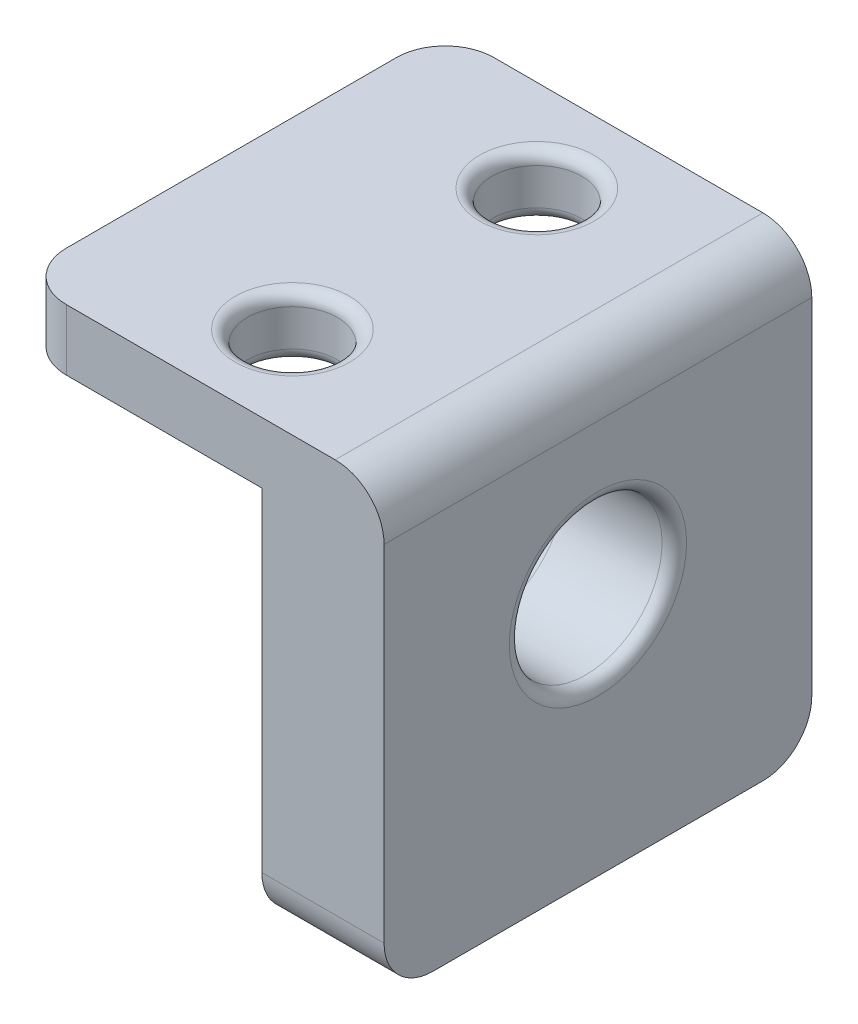
ISO-10303-21;
HEADER;
FILE_DESCRIPTION(('STEP AP214'),'2;1');
FILE_NAME('part.step','',(''),(''),'','','');
FILE_SCHEMA(('AUTOMOTIVE_DESIGN { 1 0 10303 214 1 1 1 1 }'));
ENDSEC;
DATA;
#1=APPLICATION_CONTEXT('core data for automotive mechanical design processes');
#2=APPLICATION_PROTOCOL_DEFINITION('international standard','automotive_design',2000,#1);
#3=PRODUCT_CONTEXT('',#1,'mechanical');
#4=PRODUCT('Part','Part','',(#3));
#5=PRODUCT_RELATED_PRODUCT_CATEGORY('part','',(#4));
#6=PRODUCT_DEFINITION_FORMATION('','',#4);
#7=PRODUCT_DEFINITION_CONTEXT('part definition',#1,'design');
#8=PRODUCT_DEFINITION('design','',#6,#7);
#9=PRODUCT_DEFINITION_SHAPE('','',#8);
#10=(LENGTH_UNIT() NAMED_UNIT(*) SI_UNIT(.MILLI.,.METRE.));
#11=(NAMED_UNIT(*) PLANE_ANGLE_UNIT() SI_UNIT($,.RADIAN.));
#12=(NAMED_UNIT(*) SI_UNIT($,.STERADIAN.) SOLID_ANGLE_UNIT());
#13=UNCERTAINTY_MEASURE_WITH_UNIT(LENGTH_MEASURE(1.E-05),#10,'distance_accuracy_value','');
#14=(GEOMETRIC_REPRESENTATION_CONTEXT(3) GLOBAL_UNCERTAINTY_ASSIGNED_CONTEXT((#13)) GLOBAL_UNIT_ASSIGNED_CONTEXT((#10,
#11,#12)) REPRESENTATION_CONTEXT('',''));
#15=CARTESIAN_POINT('',(0.,0.,0.));
#16=DIRECTION('',(0.,0.,1.));
#17=DIRECTION('',(1.,0.,0.));
#18=AXIS2_PLACEMENT_3D('',#15,#16,#17);
#19=CARTESIAN_POINT('',(19.05,-2.38125,11.1125));
#20=DIRECTION('',(0.,-1.,0.));
#21=DIRECTION('',(1.,0.,0.));
#22=AXIS2_PLACEMENT_3D('',#19,#20,#21);
#23=PLANE('',#22);
#24=CARTESIAN_POINT('',(9.525,-2.38125,-6.35));
#25=DIRECTION('',(0.,-1.,0.));
#26=DIRECTION('',(1.,0.,0.));
#27=AXIS2_PLACEMENT_3D('',#24,#25,#26);
#28=CIRCLE('',#27,2.9718);
#29=CARTESIAN_POINT('',(12.4968,-2.38125,-6.35));
#30=VERTEX_POINT('',#29);
#31=EDGE_CURVE('E240',#30,#30,#28,.T.);
#32=ORIENTED_EDGE('',*,*,#31,.T.);
#33=EDGE_LOOP('',(#32));
#34=FACE_BOUND('',#33,.T.);
#35=CARTESIAN_POINT('',(9.52500000000001,-2.38125,6.35));
#36=DIRECTION('',(0.,-1.,0.));
#37=DIRECTION('',(1.,0.,0.));
#38=AXIS2_PLACEMENT_3D('',#35,#36,#37);
#39=CIRCLE('',#38,2.9718);
#40=CARTESIAN_POINT('',(12.4968,-2.38125,6.35));
#41=VERTEX_POINT('',#40);
#42=EDGE_CURVE('E237',#41,#41,#39,.T.);
#43=ORIENTED_EDGE('',*,*,#42,.T.);
#44=EDGE_LOOP('',(#43));
#45=FACE_BOUND('',#44,.T.);
#46=DIRECTION('',(-1.,0.,0.));
#47=VECTOR('',#46,1.);
#48=CARTESIAN_POINT('',(19.05,-2.38125,11.1125));
#49=LINE('',#48,#47);
#50=CARTESIAN_POINT('',(16.51,-2.38125,11.1125));
#51=VERTEX_POINT('',#50);
#52=CARTESIAN_POINT('',(2.54,-2.38125,11.1125));
#53=VERTEX_POINT('',#52);
#54=EDGE_CURVE('E137',#51,#53,#49,.T.);
#55=ORIENTED_EDGE('',*,*,#54,.F.);
#56=DIRECTION('',(0.,0.,-1.));
#57=VECTOR('',#56,1.);
#58=CARTESIAN_POINT('',(16.51,-2.38125,11.1125));
#59=LINE('',#58,#57);
#60=CARTESIAN_POINT('',(16.51,-2.38125,-11.1125));
#61=VERTEX_POINT('',#60);
#62=EDGE_CURVE('E190',#51,#61,#59,.T.);
#63=ORIENTED_EDGE('',*,*,#62,.T.);
#64=DIRECTION('',(-1.,0.,0.));
#65=VECTOR('',#64,1.);
#66=CARTESIAN_POINT('',(19.05,-2.38125,-11.1125));
#67=LINE('',#66,#65);
#68=CARTESIAN_POINT('',(2.54,-2.38125,-11.1125));
#69=VERTEX_POINT('',#68);
#70=EDGE_CURVE('E157',#61,#69,#67,.T.);
#71=ORIENTED_EDGE('',*,*,#70,.T.);
#72=CARTESIAN_POINT('',(2.54,-2.38125,-8.5725));
#73=DIRECTION('',(0.,-1.,0.));
#74=DIRECTION('',(1.,0.,0.));
#75=AXIS2_PLACEMENT_3D('',#72,#73,#74);
#76=CIRCLE('',#75,2.54);
#77=CARTESIAN_POINT('',(0.,-2.38125,-8.5725));
#78=VERTEX_POINT('',#77);
#79=EDGE_CURVE('E186',#69,#78,#76,.F.);
#80=ORIENTED_EDGE('',*,*,#79,.T.);
#81=DIRECTION('',(0.,0.,-1.));
#82=VECTOR('',#81,1.);
#83=CARTESIAN_POINT('',(0.,-2.38125,11.1125));
#84=LINE('',#83,#82);
#85=CARTESIAN_POINT('',(0.,-2.38125,8.5725));
#86=VERTEX_POINT('',#85);
#87=EDGE_CURVE('E171',#86,#78,#84,.T.);
#88=ORIENTED_EDGE('',*,*,#87,.F.);
#89=CARTESIAN_POINT('',(2.54,-2.38125,8.5725));
#90=DIRECTION('',(0.,-1.,0.));
#91=DIRECTION('',(1.,0.,0.));
#92=AXIS2_PLACEMENT_3D('',#89,#90,#91);
#93=CIRCLE('',#92,2.54);
#94=EDGE_CURVE('E188',#86,#53,#93,.F.);
#95=ORIENTED_EDGE('',*,*,#94,.T.);
#96=EDGE_LOOP('',(#55,#63,#71,#80,#88,#95));
#97=FACE_BOUND('',#96,.T.);
#98=ADVANCED_FACE('F39',(#34,#45,#97),#23,.F.);
#99=CARTESIAN_POINT('',(0.,-2.38125,11.1125));
#100=DIRECTION('',(1.,0.,0.));
#101=DIRECTION('',(0.,1.,0.));
#102=AXIS2_PLACEMENT_3D('',#99,#100,#101);
#103=PLANE('',#102);
#104=DIRECTION('',(0.,0.,-1.));
#105=VECTOR('',#104,1.);
#106=CARTESIAN_POINT('',(0.,-5.55625,11.1125));
#107=LINE('',#106,#105);
#108=CARTESIAN_POINT('',(0.,-5.55625,8.5725));
#109=VERTEX_POINT('',#108);
#110=CARTESIAN_POINT('',(0.,-5.55625,-8.5725));
#111=VERTEX_POINT('',#110);
#112=EDGE_CURVE('E145',#109,#111,#107,.T.);
#113=ORIENTED_EDGE('',*,*,#112,.F.);
#114=DIRECTION('',(0.,-1.,0.));
#115=VECTOR('',#114,1.);
#116=CARTESIAN_POINT('',(0.,-2.38125,8.5725));
#117=LINE('',#116,#115);
#118=EDGE_CURVE('E217',#109,#86,#117,.F.);
#119=ORIENTED_EDGE('',*,*,#118,.T.);
#120=ORIENTED_EDGE('',*,*,#87,.T.);
#121=DIRECTION('',(0.,-1.,0.));
#122=VECTOR('',#121,1.);
#123=CARTESIAN_POINT('',(0.,-2.38125,-8.5725));
#124=LINE('',#123,#122);
#125=EDGE_CURVE('E214',#78,#111,#124,.T.);
#126=ORIENTED_EDGE('',*,*,#125,.T.);
#127=EDGE_LOOP('',(#113,#119,#120,#126));
#128=FACE_BOUND('',#127,.T.);
#129=ADVANCED_FACE('F257',(#128),#103,.F.);
#130=CARTESIAN_POINT('',(0.,-5.55625,11.1125));
#131=DIRECTION('',(0.,1.,0.));
#132=DIRECTION('',(0.,0.,1.));
#133=AXIS2_PLACEMENT_3D('',#130,#131,#132);
#134=PLANE('',#133);
#135=CARTESIAN_POINT('',(9.525,-5.55625,-6.35));
#136=DIRECTION('',(0.,1.,0.));
#137=DIRECTION('',(0.,0.,1.));
#138=AXIS2_PLACEMENT_3D('',#135,#136,#137);
#139=CIRCLE('',#138,2.9718);
#140=CARTESIAN_POINT('',(9.525,-5.55625,-3.3782));
#141=VERTEX_POINT('',#140);
#142=EDGE_CURVE('E228',#141,#141,#139,.T.);
#143=ORIENTED_EDGE('',*,*,#142,.T.);
#144=EDGE_LOOP('',(#143));
#145=FACE_BOUND('',#144,.T.);
#146=CARTESIAN_POINT('',(9.52500000000001,-5.55625,6.35));
#147=DIRECTION('',(0.,1.,0.));
#148=DIRECTION('',(0.,0.,1.));
#149=AXIS2_PLACEMENT_3D('',#146,#147,#148);
#150=CIRCLE('',#149,2.9718);
#151=CARTESIAN_POINT('',(9.52500000000001,-5.55625,9.3218));
#152=VERTEX_POINT('',#151);
#153=EDGE_CURVE('E225',#152,#152,#150,.T.);
#154=ORIENTED_EDGE('',*,*,#153,.T.);
#155=EDGE_LOOP('',(#154));
#156=FACE_BOUND('',#155,.T.);
#157=DIRECTION('',(1.,0.,0.));
#158=VECTOR('',#157,1.);
#159=CARTESIAN_POINT('',(0.,-5.55625,11.1125));
#160=LINE('',#159,#158);
#161=CARTESIAN_POINT('',(2.54,-5.55625,11.1125));
#162=VERTEX_POINT('',#161);
#163=CARTESIAN_POINT('',(12.7,-5.55625,11.1125));
#164=VERTEX_POINT('',#163);
#165=EDGE_CURVE('E125',#162,#164,#160,.T.);
#166=ORIENTED_EDGE('',*,*,#165,.F.);
#167=CARTESIAN_POINT('',(2.54,-5.55625,8.5725));
#168=DIRECTION('',(0.,1.,0.));
#169=DIRECTION('',(0.,0.,1.));
#170=AXIS2_PLACEMENT_3D('',#167,#168,#169);
#171=CIRCLE('',#170,2.54);
#172=EDGE_CURVE('E212',#162,#109,#171,.F.);
#173=ORIENTED_EDGE('',*,*,#172,.T.);
#174=ORIENTED_EDGE('',*,*,#112,.T.);
#175=CARTESIAN_POINT('',(2.54,-5.55625,-8.5725));
#176=DIRECTION('',(0.,1.,0.));
#177=DIRECTION('',(0.,0.,1.));
#178=AXIS2_PLACEMENT_3D('',#175,#176,#177);
#179=CIRCLE('',#178,2.54);
#180=CARTESIAN_POINT('',(2.54,-5.55625,-11.1125));
#181=VERTEX_POINT('',#180);
#182=EDGE_CURVE('E210',#111,#181,#179,.F.);
#183=ORIENTED_EDGE('',*,*,#182,.T.);
#184=DIRECTION('',(1.,0.,0.));
#185=VECTOR('',#184,1.);
#186=CARTESIAN_POINT('',(0.,-5.55625,-11.1125));
#187=LINE('',#186,#185);
#188=CARTESIAN_POINT('',(12.7,-5.55625,-11.1125));
#189=VERTEX_POINT('',#188);
#190=EDGE_CURVE('E143',#181,#189,#187,.T.);
#191=ORIENTED_EDGE('',*,*,#190,.T.);
#192=DIRECTION('',(0.,0.,-1.));
#193=VECTOR('',#192,1.);
#194=CARTESIAN_POINT('',(12.7,-5.55625,11.1125));
#195=LINE('',#194,#193);
#196=EDGE_CURVE('E140',#164,#189,#195,.T.);
#197=ORIENTED_EDGE('',*,*,#196,.F.);
#198=EDGE_LOOP('',(#166,#173,#174,#183,#191,#197));
#199=FACE_BOUND('',#198,.T.);
#200=ADVANCED_FACE('F141',(#145,#156,#199),#134,.F.);
#201=CARTESIAN_POINT('',(12.7,-5.55625,11.1125));
#202=DIRECTION('',(1.,0.,0.));
#203=DIRECTION('',(0.,1.,0.));
#204=AXIS2_PLACEMENT_3D('',#201,#202,#203);
#205=PLANE('',#204);
#206=CARTESIAN_POINT('',(12.7,-12.7,0.));
#207=DIRECTION('',(1.,0.,0.));
#208=DIRECTION('',(0.,1.,0.));
#209=AXIS2_PLACEMENT_3D('',#206,#207,#208);
#210=CIRCLE('',#209,4.60375);
#211=CARTESIAN_POINT('',(12.7,-8.09625,0.));
#212=VERTEX_POINT('',#211);
#213=EDGE_CURVE('E174',#212,#212,#210,.T.);
#214=ORIENTED_EDGE('',*,*,#213,.T.);
#215=EDGE_LOOP('',(#214));
#216=FACE_BOUND('',#215,.T.);
#217=DIRECTION('',(0.,-1.,0.));
#218=VECTOR('',#217,1.);
#219=CARTESIAN_POINT('',(12.7,-5.55625,-11.1125));
#220=LINE('',#219,#218);
#221=CARTESIAN_POINT('',(12.7,-22.86,-11.1125));
#222=VERTEX_POINT('',#221);
#223=EDGE_CURVE('E161',#189,#222,#220,.T.);
#224=ORIENTED_EDGE('',*,*,#223,.T.);
#225=CARTESIAN_POINT('',(12.7,-22.86,-8.5725));
#226=DIRECTION('',(1.,0.,0.));
#227=DIRECTION('',(0.,1.,0.));
#228=AXIS2_PLACEMENT_3D('',#225,#226,#227);
#229=CIRCLE('',#228,2.54);
#230=CARTESIAN_POINT('',(12.7,-25.4,-8.5725));
#231=VERTEX_POINT('',#230);
#232=EDGE_CURVE('E54',#222,#231,#229,.F.);
#233=ORIENTED_EDGE('',*,*,#232,.T.);
#234=DIRECTION('',(0.,0.,-1.));
#235=VECTOR('',#234,1.);
#236=CARTESIAN_POINT('',(12.7,-25.4,11.1125));
#237=LINE('',#236,#235);
#238=CARTESIAN_POINT('',(12.7,-25.4,8.5725));
#239=VERTEX_POINT('',#238);
#240=EDGE_CURVE('E146',#239,#231,#237,.T.);
#241=ORIENTED_EDGE('',*,*,#240,.F.);
#242=CARTESIAN_POINT('',(12.7,-22.86,8.5725));
#243=DIRECTION('',(1.,0.,0.));
#244=DIRECTION('',(0.,1.,0.));
#245=AXIS2_PLACEMENT_3D('',#242,#243,#244);
#246=CIRCLE('',#245,2.54);
#247=CARTESIAN_POINT('',(12.7,-22.86,11.1125));
#248=VERTEX_POINT('',#247);
#249=EDGE_CURVE('E150',#239,#248,#246,.F.);
#250=ORIENTED_EDGE('',*,*,#249,.T.);
#251=DIRECTION('',(0.,-1.,0.));
#252=VECTOR('',#251,1.);
#253=CARTESIAN_POINT('',(12.7,-5.55625,11.1125));
#254=LINE('',#253,#252);
#255=EDGE_CURVE('E131',#164,#248,#254,.T.);
#256=ORIENTED_EDGE('',*,*,#255,.F.);
#257=ORIENTED_EDGE('',*,*,#196,.T.);
#258=EDGE_LOOP('',(#224,#233,#241,#250,#256,#257));
#259=FACE_BOUND('',#258,.T.);
#260=ADVANCED_FACE('F148',(#216,#259),#205,.F.);
#261=CARTESIAN_POINT('',(12.7,-25.4,11.1125));
#262=DIRECTION('',(0.,1.,0.));
#263=DIRECTION('',(0.,0.,1.));
#264=AXIS2_PLACEMENT_3D('',#261,#262,#263);
#265=PLANE('',#264);
#266=ORIENTED_EDGE('',*,*,#240,.T.);
#267=DIRECTION('',(1.,0.,0.));
#268=VECTOR('',#267,1.);
#269=CARTESIAN_POINT('',(12.7,-25.4,-8.5725));
#270=LINE('',#269,#268);
#271=CARTESIAN_POINT('',(19.05,-25.4,-8.5725));
#272=VERTEX_POINT('',#271);
#273=EDGE_CURVE('E220',#231,#272,#270,.T.);
#274=ORIENTED_EDGE('',*,*,#273,.T.);
#275=DIRECTION('',(0.,0.,-1.));
#276=VECTOR('',#275,1.);
#277=CARTESIAN_POINT('',(19.05,-25.4,11.1125));
#278=LINE('',#277,#276);
#279=CARTESIAN_POINT('',(19.05,-25.4,8.5725));
#280=VERTEX_POINT('',#279);
#281=EDGE_CURVE('E153',#280,#272,#278,.T.);
#282=ORIENTED_EDGE('',*,*,#281,.F.);
#283=DIRECTION('',(1.,0.,0.));
#284=VECTOR('',#283,1.);
#285=CARTESIAN_POINT('',(12.7,-25.4,8.5725));
#286=LINE('',#285,#284);
#287=EDGE_CURVE('E61',#280,#239,#286,.F.);
#288=ORIENTED_EDGE('',*,*,#287,.T.);
#289=EDGE_LOOP('',(#266,#274,#282,#288));
#290=FACE_BOUND('',#289,.T.);
#291=ADVANCED_FACE('F332',(#290),#265,.F.);
#292=CARTESIAN_POINT('',(19.05,-25.4,11.1125));
#293=DIRECTION('',(-1.,0.,0.));
#294=DIRECTION('',(0.,0.,1.));
#295=AXIS2_PLACEMENT_3D('',#292,#293,#294);
#296=PLANE('',#295);
#297=CARTESIAN_POINT('',(19.05,-12.7,0.));
#298=DIRECTION('',(-1.,0.,0.));
#299=DIRECTION('',(0.,0.,1.));
#300=AXIS2_PLACEMENT_3D('',#297,#298,#299);
#301=CIRCLE('',#300,4.60375);
#302=CARTESIAN_POINT('',(19.05,-12.7,4.60375));
#303=VERTEX_POINT('',#302);
#304=EDGE_CURVE('E183',#303,#303,#301,.T.);
#305=ORIENTED_EDGE('',*,*,#304,.T.);
#306=EDGE_LOOP('',(#305));
#307=FACE_BOUND('',#306,.T.);
#308=DIRECTION('',(0.,1.,0.));
#309=VECTOR('',#308,1.);
#310=CARTESIAN_POINT('',(19.05,-25.4,-11.1125));
#311=LINE('',#310,#309);
#312=CARTESIAN_POINT('',(19.05,-22.86,-11.1125));
#313=VERTEX_POINT('',#312);
#314=CARTESIAN_POINT('',(19.05,-4.92125,-11.1125));
#315=VERTEX_POINT('',#314);
#316=EDGE_CURVE('E163',#313,#315,#311,.T.);
#317=ORIENTED_EDGE('',*,*,#316,.T.);
#318=DIRECTION('',(0.,0.,-1.));
#319=VECTOR('',#318,1.);
#320=CARTESIAN_POINT('',(19.05,-4.92125,11.1125));
#321=LINE('',#320,#319);
#322=CARTESIAN_POINT('',(19.05,-4.92125,11.1125));
#323=VERTEX_POINT('',#322);
#324=EDGE_CURVE('E203',#315,#323,#321,.F.);
#325=ORIENTED_EDGE('',*,*,#324,.T.);
#326=DIRECTION('',(0.,1.,0.));
#327=VECTOR('',#326,1.);
#328=CARTESIAN_POINT('',(19.05,-25.4,11.1125));
#329=LINE('',#328,#327);
#330=CARTESIAN_POINT('',(19.05,-22.86,11.1125));
#331=VERTEX_POINT('',#330);
#332=EDGE_CURVE('E151',#331,#323,#329,.T.);
#333=ORIENTED_EDGE('',*,*,#332,.F.);
#334=CARTESIAN_POINT('',(19.05,-22.86,8.5725));
#335=DIRECTION('',(-1.,0.,0.));
#336=DIRECTION('',(0.,0.,1.));
#337=AXIS2_PLACEMENT_3D('',#334,#335,#336);
#338=CIRCLE('',#337,2.54);
#339=EDGE_CURVE('E199',#331,#280,#338,.F.);
#340=ORIENTED_EDGE('',*,*,#339,.T.);
#341=ORIENTED_EDGE('',*,*,#281,.T.);
#342=CARTESIAN_POINT('',(19.05,-22.86,-8.5725));
#343=DIRECTION('',(-1.,0.,0.));
#344=DIRECTION('',(0.,0.,1.));
#345=AXIS2_PLACEMENT_3D('',#342,#343,#344);
#346=CIRCLE('',#345,2.54);
#347=EDGE_CURVE('E201',#272,#313,#346,.F.);
#348=ORIENTED_EDGE('',*,*,#347,.T.);
#349=EDGE_LOOP('',(#317,#325,#333,#340,#341,#348));
#350=FACE_BOUND('',#349,.T.);
#351=ADVANCED_FACE('F326',(#307,#350),#296,.F.);
#352=CARTESIAN_POINT('',(0.,0.,11.1125));
#353=DIRECTION('',(0.,0.,1.));
#354=DIRECTION('',(1.,0.,0.));
#355=AXIS2_PLACEMENT_3D('',#352,#353,#354);
#356=PLANE('',#355);
#357=ORIENTED_EDGE('',*,*,#332,.T.);
#358=CARTESIAN_POINT('',(16.51,-4.92125,11.1125));
#359=DIRECTION('',(0.,0.,1.));
#360=DIRECTION('',(1.,0.,0.));
#361=AXIS2_PLACEMENT_3D('',#358,#359,#360);
#362=CIRCLE('',#361,2.54);
#363=EDGE_CURVE('E208',#323,#51,#362,.T.);
#364=ORIENTED_EDGE('',*,*,#363,.T.);
#365=ORIENTED_EDGE('',*,*,#54,.T.);
#366=DIRECTION('',(0.,-1.,0.));
#367=VECTOR('',#366,1.);
#368=CARTESIAN_POINT('',(2.54,-5.55625,11.1125));
#369=LINE('',#368,#367);
#370=EDGE_CURVE('E135',#53,#162,#369,.T.);
#371=ORIENTED_EDGE('',*,*,#370,.T.);
#372=ORIENTED_EDGE('',*,*,#165,.T.);
#373=ORIENTED_EDGE('',*,*,#255,.T.);
#374=DIRECTION('',(1.,0.,0.));
#375=VECTOR('',#374,1.);
#376=CARTESIAN_POINT('',(19.05,-22.86,11.1125));
#377=LINE('',#376,#375);
#378=EDGE_CURVE('E205',#248,#331,#377,.T.);
#379=ORIENTED_EDGE('',*,*,#378,.T.);
#380=EDGE_LOOP('',(#357,#364,#365,#371,#372,#373,#379));
#381=FACE_BOUND('',#380,.T.);
#382=ADVANCED_FACE('F128',(#381),#356,.T.);
#383=CARTESIAN_POINT('',(0.,0.,-11.1125));
#384=DIRECTION('',(0.,0.,1.));
#385=DIRECTION('',(1.,0.,0.));
#386=AXIS2_PLACEMENT_3D('',#383,#384,#385);
#387=PLANE('',#386);
#388=ORIENTED_EDGE('',*,*,#70,.F.);
#389=CARTESIAN_POINT('',(16.51,-4.92125,-11.1125));
#390=DIRECTION('',(0.,0.,1.));
#391=DIRECTION('',(1.,0.,0.));
#392=AXIS2_PLACEMENT_3D('',#389,#390,#391);
#393=CIRCLE('',#392,2.54);
#394=EDGE_CURVE('E197',#61,#315,#393,.F.);
#395=ORIENTED_EDGE('',*,*,#394,.T.);
#396=ORIENTED_EDGE('',*,*,#316,.F.);
#397=DIRECTION('',(1.,0.,0.));
#398=VECTOR('',#397,1.);
#399=CARTESIAN_POINT('',(0.,-22.86,-11.1125));
#400=LINE('',#399,#398);
#401=EDGE_CURVE('E193',#313,#222,#400,.F.);
#402=ORIENTED_EDGE('',*,*,#401,.T.);
#403=ORIENTED_EDGE('',*,*,#223,.F.);
#404=ORIENTED_EDGE('',*,*,#190,.F.);
#405=DIRECTION('',(0.,-1.,0.));
#406=VECTOR('',#405,1.);
#407=CARTESIAN_POINT('',(2.54,0.,-11.1125));
#408=LINE('',#407,#406);
#409=EDGE_CURVE('E195',#181,#69,#408,.F.);
#410=ORIENTED_EDGE('',*,*,#409,.T.);
#411=EDGE_LOOP('',(#388,#395,#396,#402,#403,#404,#410));
#412=FACE_BOUND('',#411,.T.);
#413=ADVANCED_FACE('F322',(#412),#387,.F.);
#414=CARTESIAN_POINT('',(-3.17499999999999,-12.7,0.));
#415=DIRECTION('',(1.,0.,0.));
#416=DIRECTION('',(0.,0.,-1.));
#417=AXIS2_PLACEMENT_3D('',#414,#415,#416);
#418=CYLINDRICAL_SURFACE('',#417,3.96875);
#419=CARTESIAN_POINT('',(13.335,-12.7,0.));
#420=DIRECTION('',(1.,0.,0.));
#421=DIRECTION('',(0.,1.,0.));
#422=AXIS2_PLACEMENT_3D('',#419,#420,#421);
#423=CIRCLE('',#422,3.96875);
#424=CARTESIAN_POINT('',(13.335,-8.73125,0.));
#425=VERTEX_POINT('',#424);
#426=EDGE_CURVE('E180',#425,#425,#423,.F.);
#427=ORIENTED_EDGE('',*,*,#426,.T.);
#428=EDGE_LOOP('',(#427));
#429=FACE_BOUND('',#428,.T.);
#430=CARTESIAN_POINT('',(18.415,-12.7,0.));
#431=DIRECTION('',(-1.,0.,0.));
#432=DIRECTION('',(0.,0.,1.));
#433=AXIS2_PLACEMENT_3D('',#430,#431,#432);
#434=CIRCLE('',#433,3.96875);
#435=CARTESIAN_POINT('',(18.415,-12.7,3.96875));
#436=VERTEX_POINT('',#435);
#437=EDGE_CURVE('E177',#436,#436,#434,.F.);
#438=ORIENTED_EDGE('',*,*,#437,.T.);
#439=EDGE_LOOP('',(#438));
#440=FACE_BOUND('',#439,.T.);
#441=ADVANCED_FACE('F274',(#429,#440),#418,.F.);
#442=CARTESIAN_POINT('',(13.335,-12.7,0.));
#443=DIRECTION('',(1.,0.,0.));
#444=DIRECTION('',(0.,1.,0.));
#445=AXIS2_PLACEMENT_3D('',#442,#443,#444);
#446=TOROIDAL_SURFACE('',#445,4.60375,0.635);
#447=ORIENTED_EDGE('',*,*,#426,.F.);
#448=EDGE_LOOP('',(#447));
#449=FACE_BOUND('',#448,.T.);
#450=ORIENTED_EDGE('',*,*,#213,.F.);
#451=EDGE_LOOP('',(#450));
#452=FACE_BOUND('',#451,.T.);
#453=ADVANCED_FACE('F270',(#449,#452),#446,.T.);
#454=CARTESIAN_POINT('',(18.415,-12.7,0.));
#455=DIRECTION('',(-1.,0.,0.));
#456=DIRECTION('',(0.,0.,1.));
#457=AXIS2_PLACEMENT_3D('',#454,#455,#456);
#458=TOROIDAL_SURFACE('',#457,4.60375,0.635);
#459=ORIENTED_EDGE('',*,*,#304,.F.);
#460=EDGE_LOOP('',(#459));
#461=FACE_BOUND('',#460,.T.);
#462=ORIENTED_EDGE('',*,*,#437,.F.);
#463=EDGE_LOOP('',(#462));
#464=FACE_BOUND('',#463,.T.);
#465=ADVANCED_FACE('F273',(#461,#464),#458,.T.);
#466=CARTESIAN_POINT('',(16.51,-4.92125,11.1125));
#467=DIRECTION('',(0.,0.,-1.));
#468=DIRECTION('',(-1.,0.,0.));
#469=AXIS2_PLACEMENT_3D('',#466,#467,#468);
#470=CYLINDRICAL_SURFACE('',#469,2.54);
#471=ORIENTED_EDGE('',*,*,#363,.F.);
#472=ORIENTED_EDGE('',*,*,#324,.F.);
#473=ORIENTED_EDGE('',*,*,#394,.F.);
#474=ORIENTED_EDGE('',*,*,#62,.F.);
#475=EDGE_LOOP('',(#471,#472,#473,#474));
#476=FACE_BOUND('',#475,.T.);
#477=ADVANCED_FACE('F278',(#476),#470,.T.);
#478=CARTESIAN_POINT('',(2.54,0.,8.5725));
#479=DIRECTION('',(0.,1.,0.));
#480=DIRECTION('',(-1.,0.,0.));
#481=AXIS2_PLACEMENT_3D('',#478,#479,#480);
#482=CYLINDRICAL_SURFACE('',#481,2.54);
#483=ORIENTED_EDGE('',*,*,#94,.F.);
#484=ORIENTED_EDGE('',*,*,#118,.F.);
#485=ORIENTED_EDGE('',*,*,#172,.F.);
#486=ORIENTED_EDGE('',*,*,#370,.F.);
#487=EDGE_LOOP('',(#483,#484,#485,#486));
#488=FACE_BOUND('',#487,.T.);
#489=ADVANCED_FACE('F282',(#488),#482,.T.);
#490=CARTESIAN_POINT('',(2.54,-2.38125,-8.5725));
#491=DIRECTION('',(0.,-1.,0.));
#492=DIRECTION('',(1.,0.,0.));
#493=AXIS2_PLACEMENT_3D('',#490,#491,#492);
#494=CYLINDRICAL_SURFACE('',#493,2.54);
#495=ORIENTED_EDGE('',*,*,#79,.F.);
#496=ORIENTED_EDGE('',*,*,#409,.F.);
#497=ORIENTED_EDGE('',*,*,#182,.F.);
#498=ORIENTED_EDGE('',*,*,#125,.F.);
#499=EDGE_LOOP('',(#495,#496,#497,#498));
#500=FACE_BOUND('',#499,.T.);
#501=ADVANCED_FACE('F286',(#500),#494,.T.);
#502=CARTESIAN_POINT('',(12.7,-22.86,-8.5725));
#503=DIRECTION('',(1.,0.,0.));
#504=DIRECTION('',(0.,0.,-1.));
#505=AXIS2_PLACEMENT_3D('',#502,#503,#504);
#506=CYLINDRICAL_SURFACE('',#505,2.54);
#507=ORIENTED_EDGE('',*,*,#232,.F.);
#508=ORIENTED_EDGE('',*,*,#401,.F.);
#509=ORIENTED_EDGE('',*,*,#347,.F.);
#510=ORIENTED_EDGE('',*,*,#273,.F.);
#511=EDGE_LOOP('',(#507,#508,#509,#510));
#512=FACE_BOUND('',#511,.T.);
#513=ADVANCED_FACE('F290',(#512),#506,.T.);
#514=CARTESIAN_POINT('',(0.,-22.86,8.5725));
#515=DIRECTION('',(-1.,0.,0.));
#516=DIRECTION('',(0.,0.,1.));
#517=AXIS2_PLACEMENT_3D('',#514,#515,#516);
#518=CYLINDRICAL_SURFACE('',#517,2.54);
#519=ORIENTED_EDGE('',*,*,#249,.F.);
#520=ORIENTED_EDGE('',*,*,#287,.F.);
#521=ORIENTED_EDGE('',*,*,#339,.F.);
#522=ORIENTED_EDGE('',*,*,#378,.F.);
#523=EDGE_LOOP('',(#519,#520,#521,#522));
#524=FACE_BOUND('',#523,.T.);
#525=ADVANCED_FACE('F294',(#524),#518,.T.);
#526=CARTESIAN_POINT('',(9.52500000000001,-24.60625,6.35));
#527=DIRECTION('',(0.,1.,0.));
#528=DIRECTION('',(-1.,0.,0.));
#529=AXIS2_PLACEMENT_3D('',#526,#527,#528);
#530=CYLINDRICAL_SURFACE('',#529,2.3368);
#531=CARTESIAN_POINT('',(9.52500000000001,-4.92125,6.35));
#532=DIRECTION('',(0.,1.,0.));
#533=DIRECTION('',(0.,0.,1.));
#534=AXIS2_PLACEMENT_3D('',#531,#532,#533);
#535=CIRCLE('',#534,2.3368);
#536=CARTESIAN_POINT('',(9.52500000000001,-4.92125,8.6868));
#537=VERTEX_POINT('',#536);
#538=EDGE_CURVE('E11',#537,#537,#535,.F.);
#539=ORIENTED_EDGE('',*,*,#538,.T.);
#540=EDGE_LOOP('',(#539));
#541=FACE_BOUND('',#540,.T.);
#542=CARTESIAN_POINT('',(9.52500000000001,-3.01625,6.35));
#543=DIRECTION('',(0.,-1.,0.));
#544=DIRECTION('',(1.,0.,0.));
#545=AXIS2_PLACEMENT_3D('',#542,#543,#544);
#546=CIRCLE('',#545,2.3368);
#547=CARTESIAN_POINT('',(11.8618,-3.01625,6.35));
#548=VERTEX_POINT('',#547);
#549=EDGE_CURVE('E47',#548,#548,#546,.F.);
#550=ORIENTED_EDGE('',*,*,#549,.T.);
#551=EDGE_LOOP('',(#550));
#552=FACE_BOUND('',#551,.T.);
#553=ADVANCED_FACE('F245',(#541,#552),#530,.F.);
#554=CARTESIAN_POINT('',(9.52500000000001,-24.60625,-6.35));
#555=DIRECTION('',(0.,1.,0.));
#556=DIRECTION('',(-1.,0.,0.));
#557=AXIS2_PLACEMENT_3D('',#554,#555,#556);
#558=CYLINDRICAL_SURFACE('',#557,2.3368);
#559=CARTESIAN_POINT('',(9.525,-4.92125,-6.35));
#560=DIRECTION('',(0.,1.,0.));
#561=DIRECTION('',(0.,0.,1.));
#562=AXIS2_PLACEMENT_3D('',#559,#560,#561);
#563=CIRCLE('',#562,2.3368);
#564=CARTESIAN_POINT('',(9.525,-4.92125,-4.0132));
#565=VERTEX_POINT('',#564);
#566=EDGE_CURVE('E234',#565,#565,#563,.F.);
#567=ORIENTED_EDGE('',*,*,#566,.T.);
#568=EDGE_LOOP('',(#567));
#569=FACE_BOUND('',#568,.T.);
#570=CARTESIAN_POINT('',(9.525,-3.01625,-6.35));
#571=DIRECTION('',(0.,-1.,0.));
#572=DIRECTION('',(1.,0.,0.));
#573=AXIS2_PLACEMENT_3D('',#570,#571,#572);
#574=CIRCLE('',#573,2.3368);
#575=CARTESIAN_POINT('',(11.8618,-3.01625,-6.35));
#576=VERTEX_POINT('',#575);
#577=EDGE_CURVE('E231',#576,#576,#574,.F.);
#578=ORIENTED_EDGE('',*,*,#577,.T.);
#579=EDGE_LOOP('',(#578));
#580=FACE_BOUND('',#579,.T.);
#581=ADVANCED_FACE('F301',(#569,#580),#558,.F.);
#582=CARTESIAN_POINT('',(9.525,-4.92125,-6.35));
#583=DIRECTION('',(0.,1.,0.));
#584=DIRECTION('',(0.,0.,1.));
#585=AXIS2_PLACEMENT_3D('',#582,#583,#584);
#586=TOROIDAL_SURFACE('',#585,2.9718,0.635);
#587=ORIENTED_EDGE('',*,*,#566,.F.);
#588=EDGE_LOOP('',(#587));
#589=FACE_BOUND('',#588,.T.);
#590=ORIENTED_EDGE('',*,*,#142,.F.);
#591=EDGE_LOOP('',(#590));
#592=FACE_BOUND('',#591,.T.);
#593=ADVANCED_FACE('F298',(#589,#592),#586,.T.);
#594=CARTESIAN_POINT('',(9.525,-3.01625,-6.35));
#595=DIRECTION('',(0.,-1.,0.));
#596=DIRECTION('',(1.,0.,0.));
#597=AXIS2_PLACEMENT_3D('',#594,#595,#596);
#598=TOROIDAL_SURFACE('',#597,2.9718,0.635);
#599=ORIENTED_EDGE('',*,*,#31,.F.);
#600=EDGE_LOOP('',(#599));
#601=FACE_BOUND('',#600,.T.);
#602=ORIENTED_EDGE('',*,*,#577,.F.);
#603=EDGE_LOOP('',(#602));
#604=FACE_BOUND('',#603,.T.);
#605=ADVANCED_FACE('F253',(#601,#604),#598,.T.);
#606=CARTESIAN_POINT('',(9.52500000000001,-4.92125,6.35));
#607=DIRECTION('',(0.,1.,0.));
#608=DIRECTION('',(0.,0.,1.));
#609=AXIS2_PLACEMENT_3D('',#606,#607,#608);
#610=TOROIDAL_SURFACE('',#609,2.9718,0.635);
#611=ORIENTED_EDGE('',*,*,#538,.F.);
#612=EDGE_LOOP('',(#611));
#613=FACE_BOUND('',#612,.T.);
#614=ORIENTED_EDGE('',*,*,#153,.F.);
#615=EDGE_LOOP('',(#614));
#616=FACE_BOUND('',#615,.T.);
#617=ADVANCED_FACE('F248',(#613,#616),#610,.T.);
#618=CARTESIAN_POINT('',(9.52500000000001,-3.01625,6.35));
#619=DIRECTION('',(0.,-1.,0.));
#620=DIRECTION('',(1.,0.,0.));
#621=AXIS2_PLACEMENT_3D('',#618,#619,#620);
#622=TOROIDAL_SURFACE('',#621,2.9718,0.635);
#623=ORIENTED_EDGE('',*,*,#42,.F.);
#624=EDGE_LOOP('',(#623));
#625=FACE_BOUND('',#624,.T.);
#626=ORIENTED_EDGE('',*,*,#549,.F.);
#627=EDGE_LOOP('',(#626));
#628=FACE_BOUND('',#627,.T.);
#629=ADVANCED_FACE('F41',(#625,#628),#622,.T.);
#630=CLOSED_SHELL('',(#98,#129,#200,#260,#291,#351,#382,#413,#441,#453,#465,#477,#489,#501,#513,
#525,#553,#581,#593,#605,#617,#629));
#631=MANIFOLD_SOLID_BREP('B2',#630);
#632=ADVANCED_BREP_SHAPE_REPRESENTATION('',(#18,#631),#14);
#633=SHAPE_DEFINITION_REPRESENTATION(#9,#632);
ENDSEC;
END-ISO-10303-21;
